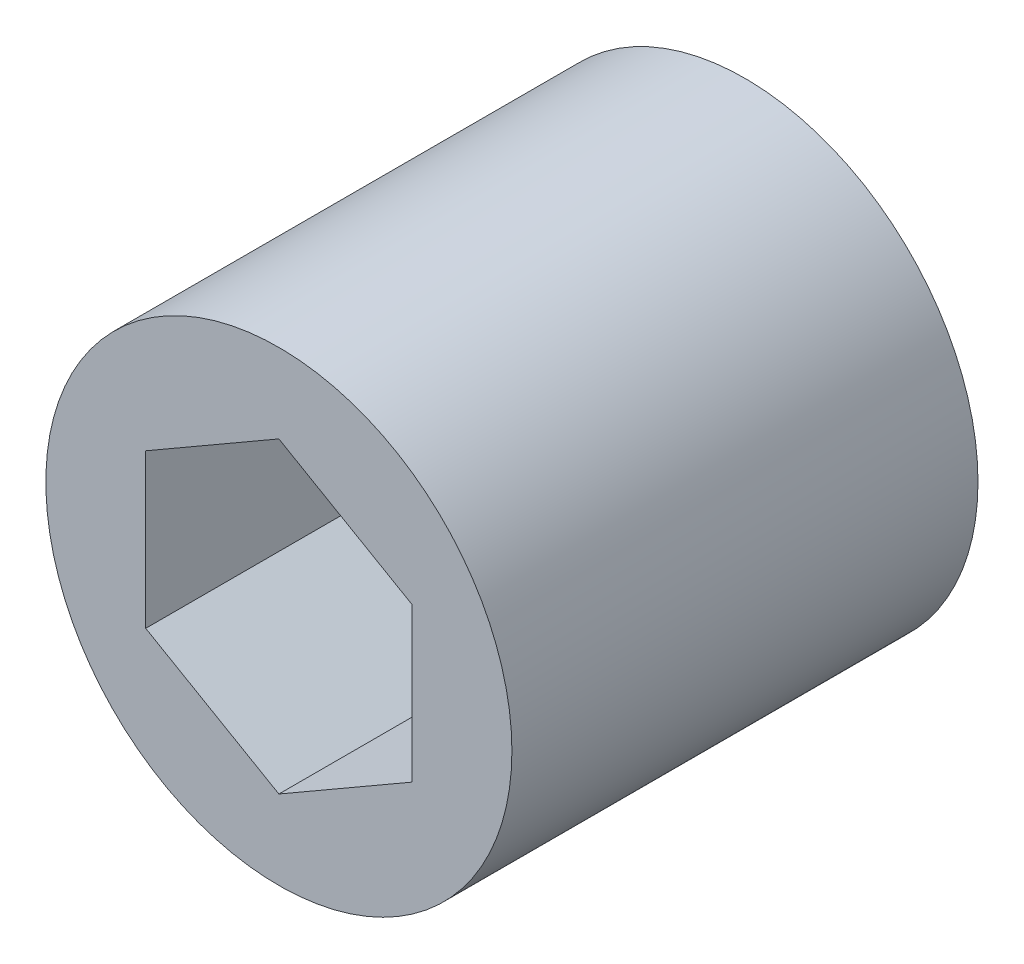
ISO-10303-21;
HEADER;
FILE_DESCRIPTION(('STEP AP214'),'2;1');
FILE_NAME('part.step','',(''),(''),'','','');
FILE_SCHEMA(('AUTOMOTIVE_DESIGN { 1 0 10303 214 1 1 1 1 }'));
ENDSEC;
DATA;
#1=APPLICATION_CONTEXT('core data for automotive mechanical design processes');
#2=APPLICATION_PROTOCOL_DEFINITION('international standard','automotive_design',2000,#1);
#3=PRODUCT_CONTEXT('',#1,'mechanical');
#4=PRODUCT('Part','Part','',(#3));
#5=PRODUCT_RELATED_PRODUCT_CATEGORY('part','',(#4));
#6=PRODUCT_DEFINITION_FORMATION('','',#4);
#7=PRODUCT_DEFINITION_CONTEXT('part definition',#1,'design');
#8=PRODUCT_DEFINITION('design','',#6,#7);
#9=PRODUCT_DEFINITION_SHAPE('','',#8);
#10=(LENGTH_UNIT() NAMED_UNIT(*) SI_UNIT(.MILLI.,.METRE.));
#11=(NAMED_UNIT(*) PLANE_ANGLE_UNIT() SI_UNIT($,.RADIAN.));
#12=(NAMED_UNIT(*) SI_UNIT($,.STERADIAN.) SOLID_ANGLE_UNIT());
#13=UNCERTAINTY_MEASURE_WITH_UNIT(LENGTH_MEASURE(1.E-05),#10,'distance_accuracy_value','');
#14=(GEOMETRIC_REPRESENTATION_CONTEXT(3) GLOBAL_UNCERTAINTY_ASSIGNED_CONTEXT((#13)) GLOBAL_UNIT_ASSIGNED_CONTEXT((#10,
#11,#12)) REPRESENTATION_CONTEXT('',''));
#15=CARTESIAN_POINT('',(0.,0.,0.));
#16=DIRECTION('',(0.,0.,1.));
#17=DIRECTION('',(1.,0.,0.));
#18=AXIS2_PLACEMENT_3D('',#15,#16,#17);
#19=CARTESIAN_POINT('',(0.,0.,22.225));
#20=DIRECTION('',(0.,0.,1.));
#21=DIRECTION('',(1.,0.,0.));
#22=AXIS2_PLACEMENT_3D('',#19,#20,#21);
#23=PLANE('',#22);
#24=CARTESIAN_POINT('',(0.,0.,22.225));
#25=DIRECTION('',(0.,0.,1.));
#26=DIRECTION('',(1.,0.,0.));
#27=AXIS2_PLACEMENT_3D('',#24,#25,#26);
#28=CIRCLE('',#27,11.1125);
#29=CARTESIAN_POINT('',(11.1125,0.,22.225));
#30=VERTEX_POINT('',#29);
#31=EDGE_CURVE('E11',#30,#30,#28,.T.);
#32=ORIENTED_EDGE('',*,*,#31,.T.);
#33=EDGE_LOOP('',(#32));
#34=FACE_BOUND('',#33,.T.);
#35=DIRECTION('',(-0.866025403784438,-0.500000000000001,0.));
#36=VECTOR('',#35,1.);
#37=CARTESIAN_POINT('',(0.,7.33234841870825,22.225));
#38=LINE('',#37,#36);
#39=CARTESIAN_POINT('',(0.,7.33234841870825,22.225));
#40=VERTEX_POINT('',#39);
#41=CARTESIAN_POINT('',(-6.35000000000001,3.66617420935411,22.225));
#42=VERTEX_POINT('',#41);
#43=EDGE_CURVE('E106',#40,#42,#38,.T.);
#44=ORIENTED_EDGE('',*,*,#43,.F.);
#45=DIRECTION('',(-0.866025403784441,0.499999999999995,0.));
#46=VECTOR('',#45,1.);
#47=CARTESIAN_POINT('',(6.34999999999996,3.6661742093542,22.225));
#48=LINE('',#47,#46);
#49=CARTESIAN_POINT('',(6.34999999999996,3.6661742093542,22.225));
#50=VERTEX_POINT('',#49);
#51=EDGE_CURVE('E97',#50,#40,#48,.T.);
#52=ORIENTED_EDGE('',*,*,#51,.F.);
#53=DIRECTION('',(0.,1.,0.));
#54=VECTOR('',#53,1.);
#55=CARTESIAN_POINT('',(6.35000000000003,-3.66617420935406,22.225));
#56=LINE('',#55,#54);
#57=CARTESIAN_POINT('',(6.35000000000003,-3.66617420935406,22.225));
#58=VERTEX_POINT('',#57);
#59=EDGE_CURVE('E131',#58,#50,#56,.T.);
#60=ORIENTED_EDGE('',*,*,#59,.F.);
#61=DIRECTION('',(0.866025403784434,0.500000000000007,0.));
#62=VECTOR('',#61,1.);
#63=CARTESIAN_POINT('',(0.,-7.33234841870825,22.225));
#64=LINE('',#63,#62);
#65=CARTESIAN_POINT('',(0.,-7.33234841870825,22.225));
#66=VERTEX_POINT('',#65);
#67=EDGE_CURVE('E128',#66,#58,#64,.T.);
#68=ORIENTED_EDGE('',*,*,#67,.F.);
#69=DIRECTION('',(0.866025403784442,-0.499999999999995,0.));
#70=VECTOR('',#69,1.);
#71=CARTESIAN_POINT('',(-6.34999999999998,-3.66617420935415,22.225));
#72=LINE('',#71,#70);
#73=CARTESIAN_POINT('',(-6.34999999999998,-3.66617420935415,22.225));
#74=VERTEX_POINT('',#73);
#75=EDGE_CURVE('E123',#74,#66,#72,.T.);
#76=ORIENTED_EDGE('',*,*,#75,.F.);
#77=DIRECTION('',(0.,-1.,0.));
#78=VECTOR('',#77,1.);
#79=CARTESIAN_POINT('',(-6.35000000000001,3.66617420935411,22.225));
#80=LINE('',#79,#78);
#81=EDGE_CURVE('E119',#42,#74,#80,.T.);
#82=ORIENTED_EDGE('',*,*,#81,.F.);
#83=EDGE_LOOP('',(#44,#52,#60,#68,#76,#82));
#84=FACE_BOUND('',#83,.T.);
#85=ADVANCED_FACE('F43',(#34,#84),#23,.T.);
#86=CARTESIAN_POINT('',(0.,0.,0.));
#87=DIRECTION('',(0.,0.,1.));
#88=DIRECTION('',(1.,0.,0.));
#89=AXIS2_PLACEMENT_3D('',#86,#87,#88);
#90=PLANE('',#89);
#91=CARTESIAN_POINT('',(0.,0.,0.));
#92=DIRECTION('',(0.,0.,1.));
#93=DIRECTION('',(1.,0.,0.));
#94=AXIS2_PLACEMENT_3D('',#91,#92,#93);
#95=CIRCLE('',#94,11.1125);
#96=CARTESIAN_POINT('',(11.1125,0.,0.));
#97=VERTEX_POINT('',#96);
#98=EDGE_CURVE('E47',#97,#97,#95,.T.);
#99=ORIENTED_EDGE('',*,*,#98,.F.);
#100=EDGE_LOOP('',(#99));
#101=FACE_BOUND('',#100,.T.);
#102=DIRECTION('',(-0.866025403784441,0.499999999999995,0.));
#103=VECTOR('',#102,1.);
#104=CARTESIAN_POINT('',(6.34999999999996,3.6661742093542,0.));
#105=LINE('',#104,#103);
#106=CARTESIAN_POINT('',(6.34999999999996,3.6661742093542,0.));
#107=VERTEX_POINT('',#106);
#108=CARTESIAN_POINT('',(0.,7.33234841870825,0.));
#109=VERTEX_POINT('',#108);
#110=EDGE_CURVE('E67',#107,#109,#105,.T.);
#111=ORIENTED_EDGE('',*,*,#110,.T.);
#112=DIRECTION('',(-0.866025403784438,-0.500000000000001,0.));
#113=VECTOR('',#112,1.);
#114=CARTESIAN_POINT('',(0.,7.33234841870825,0.));
#115=LINE('',#114,#113);
#116=CARTESIAN_POINT('',(-6.35000000000001,3.66617420935411,0.));
#117=VERTEX_POINT('',#116);
#118=EDGE_CURVE('E113',#109,#117,#115,.T.);
#119=ORIENTED_EDGE('',*,*,#118,.T.);
#120=DIRECTION('',(0.,-1.,0.));
#121=VECTOR('',#120,1.);
#122=CARTESIAN_POINT('',(-6.35000000000001,3.66617420935411,0.));
#123=LINE('',#122,#121);
#124=CARTESIAN_POINT('',(-6.34999999999998,-3.66617420935415,0.));
#125=VERTEX_POINT('',#124);
#126=EDGE_CURVE('E138',#117,#125,#123,.T.);
#127=ORIENTED_EDGE('',*,*,#126,.T.);
#128=DIRECTION('',(0.866025403784442,-0.499999999999995,0.));
#129=VECTOR('',#128,1.);
#130=CARTESIAN_POINT('',(-6.34999999999998,-3.66617420935415,0.));
#131=LINE('',#130,#129);
#132=CARTESIAN_POINT('',(0.,-7.33234841870825,0.));
#133=VERTEX_POINT('',#132);
#134=EDGE_CURVE('E142',#125,#133,#131,.T.);
#135=ORIENTED_EDGE('',*,*,#134,.T.);
#136=DIRECTION('',(0.866025403784434,0.500000000000007,0.));
#137=VECTOR('',#136,1.);
#138=CARTESIAN_POINT('',(0.,-7.33234841870825,0.));
#139=LINE('',#138,#137);
#140=CARTESIAN_POINT('',(6.35000000000003,-3.66617420935406,0.));
#141=VERTEX_POINT('',#140);
#142=EDGE_CURVE('E146',#133,#141,#139,.T.);
#143=ORIENTED_EDGE('',*,*,#142,.T.);
#144=DIRECTION('',(0.,1.,0.));
#145=VECTOR('',#144,1.);
#146=CARTESIAN_POINT('',(6.35000000000003,-3.66617420935406,0.));
#147=LINE('',#146,#145);
#148=EDGE_CURVE('E107',#141,#107,#147,.T.);
#149=ORIENTED_EDGE('',*,*,#148,.T.);
#150=EDGE_LOOP('',(#111,#119,#127,#135,#143,#149));
#151=FACE_BOUND('',#150,.T.);
#152=ADVANCED_FACE('F170',(#101,#151),#90,.F.);
#153=CARTESIAN_POINT('',(0.,0.,22.225));
#154=DIRECTION('',(0.,0.,-1.));
#155=DIRECTION('',(-1.,0.,0.));
#156=AXIS2_PLACEMENT_3D('',#153,#154,#155);
#157=CYLINDRICAL_SURFACE('',#156,11.1125);
#158=ORIENTED_EDGE('',*,*,#31,.F.);
#159=EDGE_LOOP('',(#158));
#160=FACE_BOUND('',#159,.T.);
#161=ORIENTED_EDGE('',*,*,#98,.T.);
#162=EDGE_LOOP('',(#161));
#163=FACE_BOUND('',#162,.T.);
#164=ADVANCED_FACE('F45',(#160,#163),#157,.T.);
#165=CARTESIAN_POINT('',(6.34999999999996,3.6661742093542,22.225));
#166=DIRECTION('',(-0.499999999999995,-0.866025403784441,0.));
#167=DIRECTION('',(0.866025403784441,-0.499999999999995,0.));
#168=AXIS2_PLACEMENT_3D('',#165,#166,#167);
#169=PLANE('',#168);
#170=ORIENTED_EDGE('',*,*,#110,.F.);
#171=DIRECTION('',(0.,0.,-1.));
#172=VECTOR('',#171,1.);
#173=CARTESIAN_POINT('',(6.34999999999996,3.6661742093542,22.225));
#174=LINE('',#173,#172);
#175=EDGE_CURVE('E101',#50,#107,#174,.T.);
#176=ORIENTED_EDGE('',*,*,#175,.F.);
#177=ORIENTED_EDGE('',*,*,#51,.T.);
#178=DIRECTION('',(0.,0.,-1.));
#179=VECTOR('',#178,1.);
#180=CARTESIAN_POINT('',(0.,7.33234841870825,22.225));
#181=LINE('',#180,#179);
#182=EDGE_CURVE('E100',#40,#109,#181,.T.);
#183=ORIENTED_EDGE('',*,*,#182,.T.);
#184=EDGE_LOOP('',(#170,#176,#177,#183));
#185=FACE_BOUND('',#184,.T.);
#186=ADVANCED_FACE('F99',(#185),#169,.T.);
#187=CARTESIAN_POINT('',(0.,7.33234841870825,22.225));
#188=DIRECTION('',(0.500000000000001,-0.866025403784438,0.));
#189=DIRECTION('',(0.866025403784438,0.500000000000001,0.));
#190=AXIS2_PLACEMENT_3D('',#187,#188,#189);
#191=PLANE('',#190);
#192=ORIENTED_EDGE('',*,*,#118,.F.);
#193=ORIENTED_EDGE('',*,*,#182,.F.);
#194=ORIENTED_EDGE('',*,*,#43,.T.);
#195=DIRECTION('',(0.,0.,-1.));
#196=VECTOR('',#195,1.);
#197=CARTESIAN_POINT('',(-6.35000000000001,3.66617420935411,22.225));
#198=LINE('',#197,#196);
#199=EDGE_CURVE('E115',#42,#117,#198,.T.);
#200=ORIENTED_EDGE('',*,*,#199,.T.);
#201=EDGE_LOOP('',(#192,#193,#194,#200));
#202=FACE_BOUND('',#201,.T.);
#203=ADVANCED_FACE('F110',(#202),#191,.T.);
#204=CARTESIAN_POINT('',(-6.35000000000001,3.66617420935411,22.225));
#205=DIRECTION('',(1.,0.,0.));
#206=DIRECTION('',(0.,1.,0.));
#207=AXIS2_PLACEMENT_3D('',#204,#205,#206);
#208=PLANE('',#207);
#209=ORIENTED_EDGE('',*,*,#126,.F.);
#210=ORIENTED_EDGE('',*,*,#199,.F.);
#211=ORIENTED_EDGE('',*,*,#81,.T.);
#212=DIRECTION('',(0.,0.,-1.));
#213=VECTOR('',#212,1.);
#214=CARTESIAN_POINT('',(-6.34999999999998,-3.66617420935415,22.225));
#215=LINE('',#214,#213);
#216=EDGE_CURVE('E160',#74,#125,#215,.T.);
#217=ORIENTED_EDGE('',*,*,#216,.T.);
#218=EDGE_LOOP('',(#209,#210,#211,#217));
#219=FACE_BOUND('',#218,.T.);
#220=ADVANCED_FACE('F166',(#219),#208,.T.);
#221=CARTESIAN_POINT('',(-6.34999999999998,-3.66617420935415,22.225));
#222=DIRECTION('',(0.499999999999995,0.866025403784441,0.));
#223=DIRECTION('',(-0.866025403784442,0.499999999999995,0.));
#224=AXIS2_PLACEMENT_3D('',#221,#222,#223);
#225=PLANE('',#224);
#226=ORIENTED_EDGE('',*,*,#134,.F.);
#227=ORIENTED_EDGE('',*,*,#216,.F.);
#228=ORIENTED_EDGE('',*,*,#75,.T.);
#229=DIRECTION('',(0.,0.,-1.));
#230=VECTOR('',#229,1.);
#231=CARTESIAN_POINT('',(0.,-7.33234841870825,22.225));
#232=LINE('',#231,#230);
#233=EDGE_CURVE('E157',#66,#133,#232,.T.);
#234=ORIENTED_EDGE('',*,*,#233,.T.);
#235=EDGE_LOOP('',(#226,#227,#228,#234));
#236=FACE_BOUND('',#235,.T.);
#237=ADVANCED_FACE('F178',(#236),#225,.T.);
#238=CARTESIAN_POINT('',(0.,-7.33234841870825,22.225));
#239=DIRECTION('',(-0.500000000000007,0.866025403784435,0.));
#240=DIRECTION('',(-0.866025403784435,-0.500000000000007,0.));
#241=AXIS2_PLACEMENT_3D('',#238,#239,#240);
#242=PLANE('',#241);
#243=ORIENTED_EDGE('',*,*,#142,.F.);
#244=ORIENTED_EDGE('',*,*,#233,.F.);
#245=ORIENTED_EDGE('',*,*,#67,.T.);
#246=DIRECTION('',(0.,0.,-1.));
#247=VECTOR('',#246,1.);
#248=CARTESIAN_POINT('',(6.35000000000003,-3.66617420935406,22.225));
#249=LINE('',#248,#247);
#250=EDGE_CURVE('E59',#58,#141,#249,.T.);
#251=ORIENTED_EDGE('',*,*,#250,.T.);
#252=EDGE_LOOP('',(#243,#244,#245,#251));
#253=FACE_BOUND('',#252,.T.);
#254=ADVANCED_FACE('F176',(#253),#242,.T.);
#255=CARTESIAN_POINT('',(6.35000000000003,-3.66617420935406,22.225));
#256=DIRECTION('',(-1.,0.,0.));
#257=DIRECTION('',(0.,-1.,0.));
#258=AXIS2_PLACEMENT_3D('',#255,#256,#257);
#259=PLANE('',#258);
#260=ORIENTED_EDGE('',*,*,#148,.F.);
#261=ORIENTED_EDGE('',*,*,#250,.F.);
#262=ORIENTED_EDGE('',*,*,#59,.T.);
#263=ORIENTED_EDGE('',*,*,#175,.T.);
#264=EDGE_LOOP('',(#260,#261,#262,#263));
#265=FACE_BOUND('',#264,.T.);
#266=ADVANCED_FACE('F172',(#265),#259,.T.);
#267=CLOSED_SHELL('',(#85,#152,#164,#186,#203,#220,#237,#254,#266));
#268=MANIFOLD_SOLID_BREP('B2',#267);
#269=ADVANCED_BREP_SHAPE_REPRESENTATION('',(#18,#268),#14);
#270=SHAPE_DEFINITION_REPRESENTATION(#9,#269);
ENDSEC;
END-ISO-10303-21;
